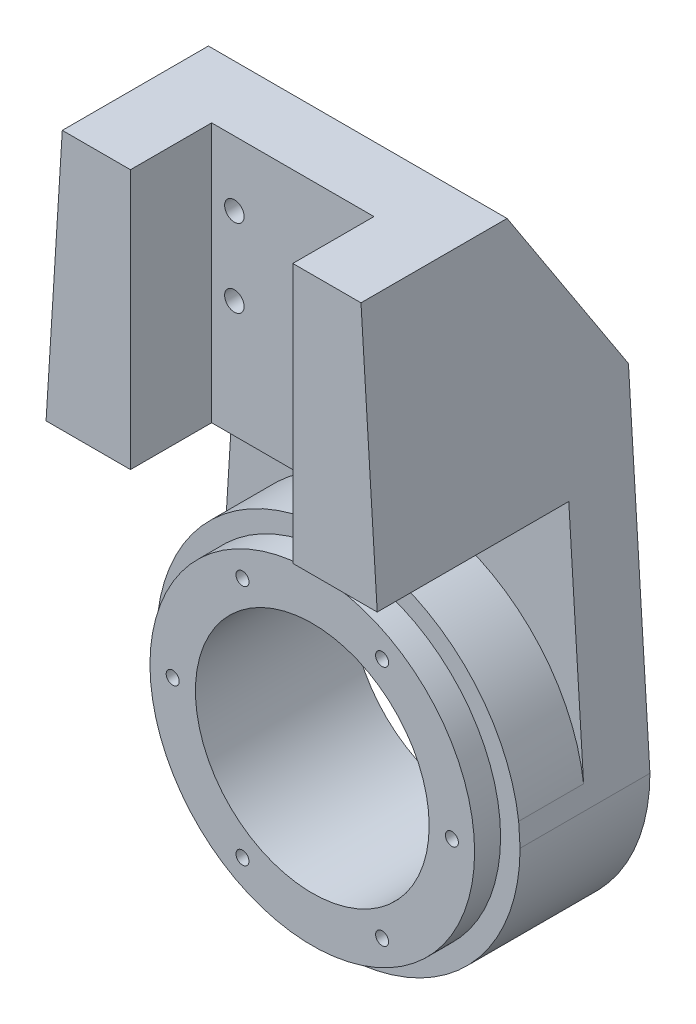
ISO-10303-21;
HEADER;
FILE_DESCRIPTION(('STEP AP214'),'2;1');
FILE_NAME('part.step','',(''),(''),'','','');
FILE_SCHEMA(('AUTOMOTIVE_DESIGN { 1 0 10303 214 1 1 1 1 }'));
ENDSEC;
DATA;
#1=APPLICATION_CONTEXT('core data for automotive mechanical design processes');
#2=APPLICATION_PROTOCOL_DEFINITION('international standard','automotive_design',2000,#1);
#3=PRODUCT_CONTEXT('',#1,'mechanical');
#4=PRODUCT('Part','Part','',(#3));
#5=PRODUCT_RELATED_PRODUCT_CATEGORY('part','',(#4));
#6=PRODUCT_DEFINITION_FORMATION('','',#4);
#7=PRODUCT_DEFINITION_CONTEXT('part definition',#1,'design');
#8=PRODUCT_DEFINITION('design','',#6,#7);
#9=PRODUCT_DEFINITION_SHAPE('','',#8);
#10=(LENGTH_UNIT() NAMED_UNIT(*) SI_UNIT(.MILLI.,.METRE.));
#11=(NAMED_UNIT(*) PLANE_ANGLE_UNIT() SI_UNIT($,.RADIAN.));
#12=(NAMED_UNIT(*) SI_UNIT($,.STERADIAN.) SOLID_ANGLE_UNIT());
#13=UNCERTAINTY_MEASURE_WITH_UNIT(LENGTH_MEASURE(1.E-05),#10,'distance_accuracy_value','');
#14=(GEOMETRIC_REPRESENTATION_CONTEXT(3) GLOBAL_UNCERTAINTY_ASSIGNED_CONTEXT((#13)) GLOBAL_UNIT_ASSIGNED_CONTEXT((#10,
#11,#12)) REPRESENTATION_CONTEXT('',''));
#15=CARTESIAN_POINT('',(0.,0.,0.));
#16=DIRECTION('',(0.,0.,1.));
#17=DIRECTION('',(1.,0.,0.));
#18=AXIS2_PLACEMENT_3D('',#15,#16,#17);
#19=CARTESIAN_POINT('',(0.,0.,10.));
#20=DIRECTION('',(0.,0.,-1.));
#21=DIRECTION('',(-1.,0.,0.));
#22=AXIS2_PLACEMENT_3D('',#19,#20,#21);
#23=CYLINDRICAL_SURFACE('',#22,28.);
#24=DIRECTION('',(0.,0.,-1.));
#25=VECTOR('',#24,1.);
#26=CARTESIAN_POINT('',(28.,0.,10.));
#27=LINE('',#26,#25);
#28=CARTESIAN_POINT('',(28.,0.,20.));
#29=VERTEX_POINT('',#28);
#30=CARTESIAN_POINT('',(28.,0.,0.));
#31=VERTEX_POINT('',#30);
#32=EDGE_CURVE('E167',#29,#31,#27,.T.);
#33=ORIENTED_EDGE('',*,*,#32,.F.);
#34=CARTESIAN_POINT('',(0.,0.,20.));
#35=DIRECTION('',(0.,0.,1.));
#36=DIRECTION('',(1.,0.,0.));
#37=AXIS2_PLACEMENT_3D('',#34,#35,#36);
#38=CIRCLE('',#37,28.);
#39=CARTESIAN_POINT('',(-28.,0.,20.));
#40=VERTEX_POINT('',#39);
#41=EDGE_CURVE('E190',#40,#29,#38,.T.);
#42=ORIENTED_EDGE('',*,*,#41,.F.);
#43=DIRECTION('',(0.,0.,-1.));
#44=VECTOR('',#43,1.);
#45=CARTESIAN_POINT('',(-28.,0.,10.));
#46=LINE('',#45,#44);
#47=CARTESIAN_POINT('',(-28.,0.,0.));
#48=VERTEX_POINT('',#47);
#49=EDGE_CURVE('E175',#40,#48,#46,.T.);
#50=ORIENTED_EDGE('',*,*,#49,.T.);
#51=CARTESIAN_POINT('',(0.,0.,0.));
#52=DIRECTION('',(0.,0.,1.));
#53=DIRECTION('',(1.,0.,0.));
#54=AXIS2_PLACEMENT_3D('',#51,#52,#53);
#55=CIRCLE('',#54,28.);
#56=EDGE_CURVE('E183',#48,#31,#55,.T.);
#57=ORIENTED_EDGE('',*,*,#56,.T.);
#58=EDGE_LOOP('',(#33,#42,#50,#57));
#59=FACE_BOUND('',#58,.T.);
#60=ADVANCED_FACE('F39',(#59),#23,.T.);
#61=CARTESIAN_POINT('',(0.,80.,10.));
#62=DIRECTION('',(0.,1.,0.));
#63=DIRECTION('',(0.,0.,1.));
#64=AXIS2_PLACEMENT_3D('',#61,#62,#63);
#65=PLANE('',#64);
#66=DIRECTION('',(0.,0.,-1.));
#67=VECTOR('',#66,1.);
#68=CARTESIAN_POINT('',(23.,80.,40.));
#69=LINE('',#68,#67);
#70=CARTESIAN_POINT('',(23.,80.,39.5));
#71=VERTEX_POINT('',#70);
#72=CARTESIAN_POINT('',(23.,80.,17.));
#73=VERTEX_POINT('',#72);
#74=EDGE_CURVE('E187',#71,#73,#69,.T.);
#75=ORIENTED_EDGE('',*,*,#74,.T.);
#76=DIRECTION('',(1.,0.,0.));
#77=VECTOR('',#76,1.);
#78=CARTESIAN_POINT('',(-25.,80.,17.));
#79=LINE('',#78,#77);
#80=CARTESIAN_POINT('',(17.,80.,17.));
#81=VERTEX_POINT('',#80);
#82=EDGE_CURVE('E228',#81,#73,#79,.T.);
#83=ORIENTED_EDGE('',*,*,#82,.F.);
#84=DIRECTION('',(1.,0.,0.));
#85=VECTOR('',#84,1.);
#86=CARTESIAN_POINT('',(5.00000000000001,80.,17.));
#87=LINE('',#86,#85);
#88=CARTESIAN_POINT('',(5.00000000000001,80.,17.));
#89=VERTEX_POINT('',#88);
#90=EDGE_CURVE('E327',#89,#81,#87,.T.);
#91=ORIENTED_EDGE('',*,*,#90,.F.);
#92=CARTESIAN_POINT('',(-5.,80.,17.));
#93=VERTEX_POINT('',#92);
#94=EDGE_CURVE('E226',#93,#89,#79,.T.);
#95=ORIENTED_EDGE('',*,*,#94,.F.);
#96=DIRECTION('',(1.,0.,0.));
#97=VECTOR('',#96,1.);
#98=CARTESIAN_POINT('',(-17.,80.,17.));
#99=LINE('',#98,#97);
#100=CARTESIAN_POINT('',(-17.,80.,17.));
#101=VERTEX_POINT('',#100);
#102=EDGE_CURVE('E225',#101,#93,#99,.T.);
#103=ORIENTED_EDGE('',*,*,#102,.F.);
#104=CARTESIAN_POINT('',(-23.,80.,17.));
#105=VERTEX_POINT('',#104);
#106=EDGE_CURVE('E214',#105,#101,#79,.T.);
#107=ORIENTED_EDGE('',*,*,#106,.F.);
#108=DIRECTION('',(0.,0.,-1.));
#109=VECTOR('',#108,1.);
#110=CARTESIAN_POINT('',(-23.,80.,40.));
#111=LINE('',#110,#109);
#112=CARTESIAN_POINT('',(-23.,80.,39.5));
#113=VERTEX_POINT('',#112);
#114=EDGE_CURVE('E61',#113,#105,#111,.T.);
#115=ORIENTED_EDGE('',*,*,#114,.F.);
#116=DIRECTION('',(-1.,0.,0.));
#117=VECTOR('',#116,1.);
#118=CARTESIAN_POINT('',(-28.,80.,39.5));
#119=LINE('',#118,#117);
#120=CARTESIAN_POINT('',(-12.5,80.,39.5));
#121=VERTEX_POINT('',#120);
#122=EDGE_CURVE('E351',#121,#113,#119,.T.);
#123=ORIENTED_EDGE('',*,*,#122,.F.);
#124=DIRECTION('',(0.,0.,1.));
#125=VECTOR('',#124,1.);
#126=CARTESIAN_POINT('',(-12.5,80.,39.5));
#127=LINE('',#126,#125);
#128=CARTESIAN_POINT('',(-12.5,80.,27.));
#129=VERTEX_POINT('',#128);
#130=EDGE_CURVE('E329',#129,#121,#127,.T.);
#131=ORIENTED_EDGE('',*,*,#130,.F.);
#132=DIRECTION('',(-1.,0.,0.));
#133=VECTOR('',#132,1.);
#134=CARTESIAN_POINT('',(-12.5,80.,27.));
#135=LINE('',#134,#133);
#136=CARTESIAN_POINT('',(12.5,80.,27.));
#137=VERTEX_POINT('',#136);
#138=EDGE_CURVE('E335',#137,#129,#135,.T.);
#139=ORIENTED_EDGE('',*,*,#138,.F.);
#140=DIRECTION('',(0.,0.,-1.));
#141=VECTOR('',#140,1.);
#142=CARTESIAN_POINT('',(12.5,80.,39.5));
#143=LINE('',#142,#141);
#144=CARTESIAN_POINT('',(12.5,80.,39.5));
#145=VERTEX_POINT('',#144);
#146=EDGE_CURVE('E331',#145,#137,#143,.T.);
#147=ORIENTED_EDGE('',*,*,#146,.F.);
#148=EDGE_CURVE('E353',#71,#145,#119,.T.);
#149=ORIENTED_EDGE('',*,*,#148,.F.);
#150=EDGE_LOOP('',(#75,#83,#91,#95,#103,#107,#115,#123,#131,#139,#147,#149));
#151=FACE_BOUND('',#150,.T.);
#152=ADVANCED_FACE('F220',(#151),#65,.T.);
#153=CARTESIAN_POINT('',(0.,0.,0.));
#154=DIRECTION('',(0.,0.,1.));
#155=DIRECTION('',(1.,0.,0.));
#156=AXIS2_PLACEMENT_3D('',#153,#154,#155);
#157=PLANE('',#156);
#158=CARTESIAN_POINT('',(-21.5,0.,0.));
#159=DIRECTION('',(0.,0.,1.));
#160=DIRECTION('',(1.,0.,0.));
#161=AXIS2_PLACEMENT_3D('',#158,#159,#160);
#162=CIRCLE('',#161,1.);
#163=CARTESIAN_POINT('',(-20.5,0.,0.));
#164=VERTEX_POINT('',#163);
#165=EDGE_CURVE('E383',#164,#164,#162,.T.);
#166=ORIENTED_EDGE('',*,*,#165,.T.);
#167=EDGE_LOOP('',(#166));
#168=FACE_BOUND('',#167,.T.);
#169=CARTESIAN_POINT('',(-10.7500000000001,-18.6195461813654,0.));
#170=DIRECTION('',(0.,0.,1.));
#171=DIRECTION('',(1.,0.,0.));
#172=AXIS2_PLACEMENT_3D('',#169,#170,#171);
#173=CIRCLE('',#172,1.);
#174=CARTESIAN_POINT('',(-9.75000000000009,-18.6195461813654,0.));
#175=VERTEX_POINT('',#174);
#176=EDGE_CURVE('E377',#175,#175,#173,.T.);
#177=ORIENTED_EDGE('',*,*,#176,.T.);
#178=EDGE_LOOP('',(#177));
#179=FACE_BOUND('',#178,.T.);
#180=CARTESIAN_POINT('',(10.75,-18.6195461813655,0.));
#181=DIRECTION('',(0.,0.,1.));
#182=DIRECTION('',(1.,0.,0.));
#183=AXIS2_PLACEMENT_3D('',#180,#181,#182);
#184=CIRCLE('',#183,1.);
#185=CARTESIAN_POINT('',(11.75,-18.6195461813655,0.));
#186=VERTEX_POINT('',#185);
#187=EDGE_CURVE('E371',#186,#186,#184,.T.);
#188=ORIENTED_EDGE('',*,*,#187,.T.);
#189=EDGE_LOOP('',(#188));
#190=FACE_BOUND('',#189,.T.);
#191=CARTESIAN_POINT('',(21.5,0.,0.));
#192=DIRECTION('',(0.,0.,1.));
#193=DIRECTION('',(1.,0.,0.));
#194=AXIS2_PLACEMENT_3D('',#191,#192,#193);
#195=CIRCLE('',#194,1.);
#196=CARTESIAN_POINT('',(22.5,0.,0.));
#197=VERTEX_POINT('',#196);
#198=EDGE_CURVE('E365',#197,#197,#195,.T.);
#199=ORIENTED_EDGE('',*,*,#198,.T.);
#200=EDGE_LOOP('',(#199));
#201=FACE_BOUND('',#200,.T.);
#202=CARTESIAN_POINT('',(10.7500000000001,18.6195461813654,0.));
#203=DIRECTION('',(0.,0.,1.));
#204=DIRECTION('',(1.,0.,0.));
#205=AXIS2_PLACEMENT_3D('',#202,#203,#204);
#206=CIRCLE('',#205,1.);
#207=CARTESIAN_POINT('',(11.7500000000001,18.6195461813654,0.));
#208=VERTEX_POINT('',#207);
#209=EDGE_CURVE('E358',#208,#208,#206,.T.);
#210=ORIENTED_EDGE('',*,*,#209,.T.);
#211=EDGE_LOOP('',(#210));
#212=FACE_BOUND('',#211,.T.);
#213=CARTESIAN_POINT('',(-10.75,18.6195461813655,0.));
#214=DIRECTION('',(0.,0.,1.));
#215=DIRECTION('',(1.,0.,0.));
#216=AXIS2_PLACEMENT_3D('',#213,#214,#215);
#217=CIRCLE('',#216,1.00000000000001);
#218=CARTESIAN_POINT('',(-9.74999999999994,18.6195461813655,0.));
#219=VERTEX_POINT('',#218);
#220=EDGE_CURVE('E388',#219,#219,#217,.T.);
#221=ORIENTED_EDGE('',*,*,#220,.T.);
#222=EDGE_LOOP('',(#221));
#223=FACE_BOUND('',#222,.T.);
#224=CARTESIAN_POINT('',(0.,0.,0.));
#225=DIRECTION('',(0.,0.,1.));
#226=DIRECTION('',(1.,0.,0.));
#227=AXIS2_PLACEMENT_3D('',#224,#225,#226);
#228=CIRCLE('',#227,18.);
#229=CARTESIAN_POINT('',(18.,0.,0.));
#230=VERTEX_POINT('',#229);
#231=EDGE_CURVE('E176',#230,#230,#228,.T.);
#232=ORIENTED_EDGE('',*,*,#231,.T.);
#233=EDGE_LOOP('',(#232));
#234=FACE_BOUND('',#233,.T.);
#235=DIRECTION('',(1.,0.,0.));
#236=VECTOR('',#235,1.);
#237=CARTESIAN_POINT('',(-25.,53.,0.));
#238=LINE('',#237,#236);
#239=CARTESIAN_POINT('',(17.,53.,0.));
#240=VERTEX_POINT('',#239);
#241=CARTESIAN_POINT('',(24.6875,53.,0.));
#242=VERTEX_POINT('',#241);
#243=EDGE_CURVE('E186',#240,#242,#238,.T.);
#244=ORIENTED_EDGE('',*,*,#243,.T.);
#245=DIRECTION('',(-0.0623782861551805,0.998052578482889,0.));
#246=VECTOR('',#245,1.);
#247=CARTESIAN_POINT('',(28.,0.,0.));
#248=LINE('',#247,#246);
#249=EDGE_CURVE('E53',#31,#242,#248,.T.);
#250=ORIENTED_EDGE('',*,*,#249,.F.);
#251=ORIENTED_EDGE('',*,*,#56,.F.);
#252=DIRECTION('',(0.0623782861551805,0.998052578482889,0.));
#253=VECTOR('',#252,1.);
#254=CARTESIAN_POINT('',(-28.,0.,0.));
#255=LINE('',#254,#253);
#256=CARTESIAN_POINT('',(-24.6875,53.,0.));
#257=VERTEX_POINT('',#256);
#258=EDGE_CURVE('E251',#48,#257,#255,.T.);
#259=ORIENTED_EDGE('',*,*,#258,.T.);
#260=CARTESIAN_POINT('',(-17.,53.,0.));
#261=VERTEX_POINT('',#260);
#262=EDGE_CURVE('E216',#257,#261,#238,.T.);
#263=ORIENTED_EDGE('',*,*,#262,.T.);
#264=DIRECTION('',(-1.,0.,0.));
#265=VECTOR('',#264,1.);
#266=CARTESIAN_POINT('',(-17.,53.,0.));
#267=LINE('',#266,#265);
#268=CARTESIAN_POINT('',(-5.,53.,0.));
#269=VERTEX_POINT('',#268);
#270=EDGE_CURVE('E324',#269,#261,#267,.T.);
#271=ORIENTED_EDGE('',*,*,#270,.F.);
#272=CARTESIAN_POINT('',(5.,53.,0.));
#273=VERTEX_POINT('',#272);
#274=EDGE_CURVE('E229',#269,#273,#238,.T.);
#275=ORIENTED_EDGE('',*,*,#274,.T.);
#276=DIRECTION('',(-1.,0.,0.));
#277=VECTOR('',#276,1.);
#278=CARTESIAN_POINT('',(5.,53.,0.));
#279=LINE('',#278,#277);
#280=EDGE_CURVE('E480',#240,#273,#279,.T.);
#281=ORIENTED_EDGE('',*,*,#280,.F.);
#282=EDGE_LOOP('',(#244,#250,#251,#259,#263,#271,#275,#281));
#283=FACE_BOUND('',#282,.T.);
#284=ADVANCED_FACE('F181',(#168,#179,#190,#201,#212,#223,#234,#283),#157,.F.);
#285=CARTESIAN_POINT('',(0.,0.,39.5));
#286=DIRECTION('',(0.,0.,-1.));
#287=DIRECTION('',(-1.,0.,0.));
#288=AXIS2_PLACEMENT_3D('',#285,#286,#287);
#289=PLANE('',#288);
#290=DIRECTION('',(0.0623782861551805,0.998052578482889,0.));
#291=VECTOR('',#290,1.);
#292=CARTESIAN_POINT('',(-27.8910505836576,1.7431906614786,39.5));
#293=LINE('',#292,#291);
#294=CARTESIAN_POINT('',(-25.5,40.,39.5));
#295=VERTEX_POINT('',#294);
#296=EDGE_CURVE('E241',#295,#113,#293,.T.);
#297=ORIENTED_EDGE('',*,*,#296,.F.);
#298=DIRECTION('',(1.,0.,0.));
#299=VECTOR('',#298,1.);
#300=CARTESIAN_POINT('',(-28.,40.,39.5));
#301=LINE('',#300,#299);
#302=CARTESIAN_POINT('',(-12.5,40.,39.5));
#303=VERTEX_POINT('',#302);
#304=EDGE_CURVE('E349',#295,#303,#301,.T.);
#305=ORIENTED_EDGE('',*,*,#304,.T.);
#306=DIRECTION('',(0.,1.,0.));
#307=VECTOR('',#306,1.);
#308=CARTESIAN_POINT('',(-12.5,0.,39.5));
#309=LINE('',#308,#307);
#310=EDGE_CURVE('E204',#303,#121,#309,.T.);
#311=ORIENTED_EDGE('',*,*,#310,.T.);
#312=ORIENTED_EDGE('',*,*,#122,.T.);
#313=EDGE_LOOP('',(#297,#305,#311,#312));
#314=FACE_BOUND('',#313,.T.);
#315=ADVANCED_FACE('F425',(#314),#289,.F.);
#316=CARTESIAN_POINT('',(0.,0.,10.));
#317=DIRECTION('',(0.,0.,1.));
#318=DIRECTION('',(1.,0.,0.));
#319=AXIS2_PLACEMENT_3D('',#316,#317,#318);
#320=PLANE('',#319);
#321=DIRECTION('',(0.0623782861551805,-0.998052578482889,0.));
#322=VECTOR('',#321,1.);
#323=CARTESIAN_POINT('',(27.8910505836576,1.7431906614786,10.));
#324=LINE('',#323,#322);
#325=CARTESIAN_POINT('',(25.5,40.,10.));
#326=VERTEX_POINT('',#325);
#327=CARTESIAN_POINT('',(27.7821011673152,3.48638132295738,10.));
#328=VERTEX_POINT('',#327);
#329=EDGE_CURVE('E257',#326,#328,#324,.T.);
#330=ORIENTED_EDGE('',*,*,#329,.F.);
#331=DIRECTION('',(1.,0.,0.));
#332=VECTOR('',#331,1.);
#333=CARTESIAN_POINT('',(-28.,40.,10.));
#334=LINE('',#333,#332);
#335=CARTESIAN_POINT('',(-25.5,40.,10.));
#336=VERTEX_POINT('',#335);
#337=EDGE_CURVE('E348',#336,#326,#334,.T.);
#338=ORIENTED_EDGE('',*,*,#337,.F.);
#339=DIRECTION('',(-0.0623782861551805,-0.998052578482889,0.));
#340=VECTOR('',#339,1.);
#341=CARTESIAN_POINT('',(-27.8910505836576,1.7431906614786,10.));
#342=LINE('',#341,#340);
#343=CARTESIAN_POINT('',(-27.7821011673152,3.48638132295738,10.));
#344=VERTEX_POINT('',#343);
#345=EDGE_CURVE('E245',#336,#344,#342,.T.);
#346=ORIENTED_EDGE('',*,*,#345,.T.);
#347=CARTESIAN_POINT('',(0.,0.,10.));
#348=DIRECTION('',(0.,0.,1.));
#349=DIRECTION('',(1.,0.,0.));
#350=AXIS2_PLACEMENT_3D('',#347,#348,#349);
#351=CIRCLE('',#350,28.);
#352=EDGE_CURVE('E197',#328,#344,#351,.T.);
#353=ORIENTED_EDGE('',*,*,#352,.F.);
#354=EDGE_LOOP('',(#330,#338,#346,#353));
#355=FACE_BOUND('',#354,.T.);
#356=ADVANCED_FACE('F414',(#355),#320,.T.);
#357=CARTESIAN_POINT('',(27.7821011673152,3.48638132295725,20.));
#358=VERTEX_POINT('',#357);
#359=CARTESIAN_POINT('',(-27.7821011673152,3.48638132295725,20.));
#360=VERTEX_POINT('',#359);
#361=EDGE_CURVE('E194',#358,#360,#38,.T.);
#362=ORIENTED_EDGE('',*,*,#361,.F.);
#363=DIRECTION('',(0.,0.,-1.));
#364=VECTOR('',#363,1.);
#365=CARTESIAN_POINT('',(27.7821011673152,3.48638132295725,10.));
#366=LINE('',#365,#364);
#367=EDGE_CURVE('E254',#358,#328,#366,.T.);
#368=ORIENTED_EDGE('',*,*,#367,.T.);
#369=ORIENTED_EDGE('',*,*,#352,.T.);
#370=DIRECTION('',(0.,0.,-1.));
#371=VECTOR('',#370,1.);
#372=CARTESIAN_POINT('',(-27.7821011673152,3.48638132295725,10.));
#373=LINE('',#372,#371);
#374=EDGE_CURVE('E237',#360,#344,#373,.T.);
#375=ORIENTED_EDGE('',*,*,#374,.F.);
#376=EDGE_LOOP('',(#362,#368,#369,#375));
#377=FACE_BOUND('',#376,.T.);
#378=ADVANCED_FACE('F41',(#377),#23,.T.);
#379=CARTESIAN_POINT('',(0.,0.,20.));
#380=DIRECTION('',(0.,0.,1.));
#381=DIRECTION('',(1.,0.,0.));
#382=AXIS2_PLACEMENT_3D('',#379,#380,#381);
#383=PLANE('',#382);
#384=DIRECTION('',(0.0623782861551805,-0.998052578482889,0.));
#385=VECTOR('',#384,1.);
#386=CARTESIAN_POINT('',(27.8910505836576,1.7431906614786,20.));
#387=LINE('',#386,#385);
#388=EDGE_CURVE('E170',#358,#29,#387,.T.);
#389=ORIENTED_EDGE('',*,*,#388,.F.);
#390=ORIENTED_EDGE('',*,*,#361,.T.);
#391=DIRECTION('',(-0.0623782861551805,-0.998052578482889,0.));
#392=VECTOR('',#391,1.);
#393=CARTESIAN_POINT('',(-27.8910505836576,1.7431906614786,20.));
#394=LINE('',#393,#392);
#395=EDGE_CURVE('E233',#360,#40,#394,.T.);
#396=ORIENTED_EDGE('',*,*,#395,.T.);
#397=ORIENTED_EDGE('',*,*,#41,.T.);
#398=EDGE_LOOP('',(#389,#390,#396,#397));
#399=FACE_BOUND('',#398,.T.);
#400=CARTESIAN_POINT('',(0.,0.,20.));
#401=DIRECTION('',(0.,0.,1.));
#402=DIRECTION('',(1.,0.,0.));
#403=AXIS2_PLACEMENT_3D('',#400,#401,#402);
#404=CIRCLE('',#403,25.);
#405=CARTESIAN_POINT('',(25.,0.,20.));
#406=VERTEX_POINT('',#405);
#407=EDGE_CURVE('E200',#406,#406,#404,.T.);
#408=ORIENTED_EDGE('',*,*,#407,.F.);
#409=EDGE_LOOP('',(#408));
#410=FACE_BOUND('',#409,.T.);
#411=ADVANCED_FACE('F404',(#399,#410),#383,.T.);
#412=CARTESIAN_POINT('',(-28.,40.,39.5));
#413=DIRECTION('',(0.,1.,0.));
#414=DIRECTION('',(0.,0.,1.));
#415=AXIS2_PLACEMENT_3D('',#412,#413,#414);
#416=PLANE('',#415);
#417=ORIENTED_EDGE('',*,*,#337,.T.);
#418=DIRECTION('',(0.,0.,1.));
#419=VECTOR('',#418,1.);
#420=CARTESIAN_POINT('',(25.5,40.,39.5));
#421=LINE('',#420,#419);
#422=CARTESIAN_POINT('',(25.5,40.,39.5));
#423=VERTEX_POINT('',#422);
#424=EDGE_CURVE('E259',#326,#423,#421,.T.);
#425=ORIENTED_EDGE('',*,*,#424,.T.);
#426=CARTESIAN_POINT('',(12.5,40.,39.5));
#427=VERTEX_POINT('',#426);
#428=EDGE_CURVE('E352',#427,#423,#301,.T.);
#429=ORIENTED_EDGE('',*,*,#428,.F.);
#430=DIRECTION('',(0.,0.,-1.));
#431=VECTOR('',#430,1.);
#432=CARTESIAN_POINT('',(12.5,40.,39.5));
#433=LINE('',#432,#431);
#434=CARTESIAN_POINT('',(12.5,40.,27.));
#435=VERTEX_POINT('',#434);
#436=EDGE_CURVE('E341',#427,#435,#433,.T.);
#437=ORIENTED_EDGE('',*,*,#436,.T.);
#438=DIRECTION('',(-1.,0.,0.));
#439=VECTOR('',#438,1.);
#440=CARTESIAN_POINT('',(-28.,40.,27.));
#441=LINE('',#440,#439);
#442=CARTESIAN_POINT('',(-12.5,40.,27.));
#443=VERTEX_POINT('',#442);
#444=EDGE_CURVE('E207',#435,#443,#441,.T.);
#445=ORIENTED_EDGE('',*,*,#444,.T.);
#446=DIRECTION('',(0.,0.,1.));
#447=VECTOR('',#446,1.);
#448=CARTESIAN_POINT('',(-12.5,40.,39.5));
#449=LINE('',#448,#447);
#450=EDGE_CURVE('E345',#443,#303,#449,.T.);
#451=ORIENTED_EDGE('',*,*,#450,.T.);
#452=ORIENTED_EDGE('',*,*,#304,.F.);
#453=DIRECTION('',(0.,0.,1.));
#454=VECTOR('',#453,1.);
#455=CARTESIAN_POINT('',(-25.5,40.,39.5));
#456=LINE('',#455,#454);
#457=EDGE_CURVE('E248',#336,#295,#456,.T.);
#458=ORIENTED_EDGE('',*,*,#457,.F.);
#459=EDGE_LOOP('',(#417,#425,#429,#437,#445,#451,#452,#458));
#460=FACE_BOUND('',#459,.T.);
#461=ADVANCED_FACE('F406',(#460),#416,.F.);
#462=CARTESIAN_POINT('',(-25.,53.,0.));
#463=DIRECTION('',(0.,0.532813269686139,-0.846232840089751));
#464=DIRECTION('',(0.,0.846232840089751,0.532813269686139));
#465=AXIS2_PLACEMENT_3D('',#462,#463,#464);
#466=PLANE('',#465);
#467=ORIENTED_EDGE('',*,*,#262,.F.);
#468=DIRECTION('',(0.0528157332421895,0.845051731875034,0.532069608958355));
#469=VECTOR('',#468,1.);
#470=CARTESIAN_POINT('',(-24.6883717192743,52.9860524916105,-0.00878176454156829));
#471=LINE('',#470,#469);
#472=EDGE_CURVE('E47',#257,#105,#471,.T.);
#473=ORIENTED_EDGE('',*,*,#472,.T.);
#474=ORIENTED_EDGE('',*,*,#106,.T.);
#475=DIRECTION('',(0.,-0.846232840089751,-0.532813269686139));
#476=VECTOR('',#475,1.);
#477=CARTESIAN_POINT('',(-17.,53.,0.));
#478=LINE('',#477,#476);
#479=EDGE_CURVE('E315',#101,#261,#478,.T.);
#480=ORIENTED_EDGE('',*,*,#479,.T.);
#481=EDGE_LOOP('',(#467,#473,#474,#480));
#482=FACE_BOUND('',#481,.T.);
#483=ADVANCED_FACE('F212',(#482),#466,.T.);
#484=CARTESIAN_POINT('',(-17.,53.,0.));
#485=DIRECTION('',(-1.,0.,0.));
#486=DIRECTION('',(0.,0.,1.));
#487=AXIS2_PLACEMENT_3D('',#484,#485,#486);
#488=PLANE('',#487);
#489=ORIENTED_EDGE('',*,*,#479,.F.);
#490=DIRECTION('',(0.,1.,0.));
#491=VECTOR('',#490,1.);
#492=CARTESIAN_POINT('',(-17.,53.,17.));
#493=LINE('',#492,#491);
#494=CARTESIAN_POINT('',(-17.,53.,17.));
#495=VERTEX_POINT('',#494);
#496=EDGE_CURVE('E313',#495,#101,#493,.T.);
#497=ORIENTED_EDGE('',*,*,#496,.F.);
#498=DIRECTION('',(0.,0.,1.));
#499=VECTOR('',#498,1.);
#500=CARTESIAN_POINT('',(-17.,53.,0.));
#501=LINE('',#500,#499);
#502=EDGE_CURVE('E314',#261,#495,#501,.T.);
#503=ORIENTED_EDGE('',*,*,#502,.F.);
#504=EDGE_LOOP('',(#489,#497,#503));
#505=FACE_BOUND('',#504,.T.);
#506=ADVANCED_FACE('F503',(#505),#488,.F.);
#507=CARTESIAN_POINT('',(-5.,53.,0.));
#508=DIRECTION('',(1.,0.,0.));
#509=DIRECTION('',(0.,0.,-1.));
#510=AXIS2_PLACEMENT_3D('',#507,#508,#509);
#511=PLANE('',#510);
#512=DIRECTION('',(0.,0.846232840089751,0.532813269686139));
#513=VECTOR('',#512,1.);
#514=CARTESIAN_POINT('',(-5.,53.,0.));
#515=LINE('',#514,#513);
#516=EDGE_CURVE('E320',#269,#93,#515,.T.);
#517=ORIENTED_EDGE('',*,*,#516,.F.);
#518=DIRECTION('',(0.,0.,-1.));
#519=VECTOR('',#518,1.);
#520=CARTESIAN_POINT('',(-5.,53.,0.));
#521=LINE('',#520,#519);
#522=CARTESIAN_POINT('',(-4.99999999999999,53.,17.));
#523=VERTEX_POINT('',#522);
#524=EDGE_CURVE('E497',#523,#269,#521,.T.);
#525=ORIENTED_EDGE('',*,*,#524,.F.);
#526=DIRECTION('',(0.,1.,0.));
#527=VECTOR('',#526,1.);
#528=CARTESIAN_POINT('',(-4.99999999999999,53.,17.));
#529=LINE('',#528,#527);
#530=EDGE_CURVE('E311',#523,#93,#529,.T.);
#531=ORIENTED_EDGE('',*,*,#530,.T.);
#532=EDGE_LOOP('',(#517,#525,#531));
#533=FACE_BOUND('',#532,.T.);
#534=ADVANCED_FACE('F505',(#533),#511,.F.);
#535=CARTESIAN_POINT('',(5.,53.,0.));
#536=DIRECTION('',(-1.,0.,0.));
#537=DIRECTION('',(0.,0.,1.));
#538=AXIS2_PLACEMENT_3D('',#535,#536,#537);
#539=PLANE('',#538);
#540=DIRECTION('',(0.,-0.846232840089751,-0.532813269686139));
#541=VECTOR('',#540,1.);
#542=CARTESIAN_POINT('',(5.,53.,0.));
#543=LINE('',#542,#541);
#544=EDGE_CURVE('E474',#89,#273,#543,.T.);
#545=ORIENTED_EDGE('',*,*,#544,.F.);
#546=DIRECTION('',(0.,1.,0.));
#547=VECTOR('',#546,1.);
#548=CARTESIAN_POINT('',(5.00000000000001,53.,17.));
#549=LINE('',#548,#547);
#550=CARTESIAN_POINT('',(5.00000000000001,53.,17.));
#551=VERTEX_POINT('',#550);
#552=EDGE_CURVE('E487',#551,#89,#549,.T.);
#553=ORIENTED_EDGE('',*,*,#552,.F.);
#554=DIRECTION('',(0.,0.,1.));
#555=VECTOR('',#554,1.);
#556=CARTESIAN_POINT('',(5.,53.,0.));
#557=LINE('',#556,#555);
#558=EDGE_CURVE('E494',#273,#551,#557,.T.);
#559=ORIENTED_EDGE('',*,*,#558,.F.);
#560=EDGE_LOOP('',(#545,#553,#559));
#561=FACE_BOUND('',#560,.T.);
#562=ADVANCED_FACE('F511',(#561),#539,.F.);
#563=CARTESIAN_POINT('',(17.,53.,0.));
#564=DIRECTION('',(1.,0.,0.));
#565=DIRECTION('',(0.,0.,-1.));
#566=AXIS2_PLACEMENT_3D('',#563,#564,#565);
#567=PLANE('',#566);
#568=DIRECTION('',(0.,0.846232840089751,0.532813269686139));
#569=VECTOR('',#568,1.);
#570=CARTESIAN_POINT('',(17.,53.,0.));
#571=LINE('',#570,#569);
#572=EDGE_CURVE('E466',#240,#81,#571,.T.);
#573=ORIENTED_EDGE('',*,*,#572,.F.);
#574=DIRECTION('',(0.,0.,-1.));
#575=VECTOR('',#574,1.);
#576=CARTESIAN_POINT('',(17.,53.,0.));
#577=LINE('',#576,#575);
#578=CARTESIAN_POINT('',(17.,53.,17.));
#579=VERTEX_POINT('',#578);
#580=EDGE_CURVE('E471',#579,#240,#577,.T.);
#581=ORIENTED_EDGE('',*,*,#580,.F.);
#582=DIRECTION('',(0.,1.,0.));
#583=VECTOR('',#582,1.);
#584=CARTESIAN_POINT('',(17.,53.,17.));
#585=LINE('',#584,#583);
#586=EDGE_CURVE('E332',#579,#81,#585,.T.);
#587=ORIENTED_EDGE('',*,*,#586,.T.);
#588=EDGE_LOOP('',(#573,#581,#587));
#589=FACE_BOUND('',#588,.T.);
#590=ADVANCED_FACE('F432',(#589),#567,.F.);
#591=CARTESIAN_POINT('',(0.,0.,10.));
#592=DIRECTION('',(0.,0.,-1.));
#593=DIRECTION('',(-1.,0.,0.));
#594=AXIS2_PLACEMENT_3D('',#591,#592,#593);
#595=CYLINDRICAL_SURFACE('',#594,18.);
#596=ORIENTED_EDGE('',*,*,#231,.F.);
#597=EDGE_LOOP('',(#596));
#598=FACE_BOUND('',#597,.T.);
#599=CARTESIAN_POINT('',(0.,0.,24.));
#600=DIRECTION('',(0.,0.,1.));
#601=DIRECTION('',(1.,0.,0.));
#602=AXIS2_PLACEMENT_3D('',#599,#600,#601);
#603=CIRCLE('',#602,18.);
#604=CARTESIAN_POINT('',(18.,0.,24.));
#605=VERTEX_POINT('',#604);
#606=EDGE_CURVE('E391',#605,#605,#603,.T.);
#607=ORIENTED_EDGE('',*,*,#606,.T.);
#608=EDGE_LOOP('',(#607));
#609=FACE_BOUND('',#608,.T.);
#610=ADVANCED_FACE('F429',(#598,#609),#595,.F.);
#611=CARTESIAN_POINT('',(0.,0.,24.));
#612=DIRECTION('',(0.,0.,1.));
#613=DIRECTION('',(1.,0.,0.));
#614=AXIS2_PLACEMENT_3D('',#611,#612,#613);
#615=PLANE('',#614);
#616=CARTESIAN_POINT('',(-21.5,0.,24.));
#617=DIRECTION('',(0.,0.,1.));
#618=DIRECTION('',(1.,0.,0.));
#619=AXIS2_PLACEMENT_3D('',#616,#617,#618);
#620=CIRCLE('',#619,1.);
#621=CARTESIAN_POINT('',(-20.5,0.,24.));
#622=VERTEX_POINT('',#621);
#623=EDGE_CURVE('E355',#622,#622,#620,.T.);
#624=ORIENTED_EDGE('',*,*,#623,.F.);
#625=EDGE_LOOP('',(#624));
#626=FACE_BOUND('',#625,.T.);
#627=CARTESIAN_POINT('',(-10.7500000000001,-18.6195461813654,24.));
#628=DIRECTION('',(0.,0.,1.));
#629=DIRECTION('',(1.,0.,0.));
#630=AXIS2_PLACEMENT_3D('',#627,#628,#629);
#631=CIRCLE('',#630,1.);
#632=CARTESIAN_POINT('',(-9.75000000000009,-18.6195461813654,24.));
#633=VERTEX_POINT('',#632);
#634=EDGE_CURVE('E380',#633,#633,#631,.T.);
#635=ORIENTED_EDGE('',*,*,#634,.F.);
#636=EDGE_LOOP('',(#635));
#637=FACE_BOUND('',#636,.T.);
#638=CARTESIAN_POINT('',(10.75,-18.6195461813655,24.));
#639=DIRECTION('',(0.,0.,1.));
#640=DIRECTION('',(1.,0.,0.));
#641=AXIS2_PLACEMENT_3D('',#638,#639,#640);
#642=CIRCLE('',#641,1.);
#643=CARTESIAN_POINT('',(11.75,-18.6195461813655,24.));
#644=VERTEX_POINT('',#643);
#645=EDGE_CURVE('E374',#644,#644,#642,.T.);
#646=ORIENTED_EDGE('',*,*,#645,.F.);
#647=EDGE_LOOP('',(#646));
#648=FACE_BOUND('',#647,.T.);
#649=CARTESIAN_POINT('',(21.5,0.,24.));
#650=DIRECTION('',(0.,0.,1.));
#651=DIRECTION('',(1.,0.,0.));
#652=AXIS2_PLACEMENT_3D('',#649,#650,#651);
#653=CIRCLE('',#652,1.);
#654=CARTESIAN_POINT('',(22.5,0.,24.));
#655=VERTEX_POINT('',#654);
#656=EDGE_CURVE('E368',#655,#655,#653,.T.);
#657=ORIENTED_EDGE('',*,*,#656,.F.);
#658=EDGE_LOOP('',(#657));
#659=FACE_BOUND('',#658,.T.);
#660=CARTESIAN_POINT('',(10.7500000000001,18.6195461813654,24.));
#661=DIRECTION('',(0.,0.,1.));
#662=DIRECTION('',(1.,0.,0.));
#663=AXIS2_PLACEMENT_3D('',#660,#661,#662);
#664=CIRCLE('',#663,1.);
#665=CARTESIAN_POINT('',(11.7500000000001,18.6195461813654,24.));
#666=VERTEX_POINT('',#665);
#667=EDGE_CURVE('E362',#666,#666,#664,.T.);
#668=ORIENTED_EDGE('',*,*,#667,.F.);
#669=EDGE_LOOP('',(#668));
#670=FACE_BOUND('',#669,.T.);
#671=CARTESIAN_POINT('',(-10.75,18.6195461813655,24.));
#672=DIRECTION('',(0.,0.,1.));
#673=DIRECTION('',(1.,0.,0.));
#674=AXIS2_PLACEMENT_3D('',#671,#672,#673);
#675=CIRCLE('',#674,1.00000000000001);
#676=CARTESIAN_POINT('',(-9.74999999999994,18.6195461813655,24.));
#677=VERTEX_POINT('',#676);
#678=EDGE_CURVE('E361',#677,#677,#675,.T.);
#679=ORIENTED_EDGE('',*,*,#678,.F.);
#680=EDGE_LOOP('',(#679));
#681=FACE_BOUND('',#680,.T.);
#682=CARTESIAN_POINT('',(0.,0.,24.));
#683=DIRECTION('',(0.,0.,1.));
#684=DIRECTION('',(1.,0.,0.));
#685=AXIS2_PLACEMENT_3D('',#682,#683,#684);
#686=CIRCLE('',#685,25.);
#687=CARTESIAN_POINT('',(25.,0.,24.));
#688=VERTEX_POINT('',#687);
#689=EDGE_CURVE('E396',#688,#688,#686,.T.);
#690=ORIENTED_EDGE('',*,*,#689,.T.);
#691=EDGE_LOOP('',(#690));
#692=FACE_BOUND('',#691,.T.);
#693=ORIENTED_EDGE('',*,*,#606,.F.);
#694=EDGE_LOOP('',(#693));
#695=FACE_BOUND('',#694,.T.);
#696=ADVANCED_FACE('F431',(#626,#637,#648,#659,#670,#681,#692,#695),#615,.T.);
#697=CARTESIAN_POINT('',(0.,0.,24.));
#698=DIRECTION('',(0.,0.,-1.));
#699=DIRECTION('',(-1.,0.,0.));
#700=AXIS2_PLACEMENT_3D('',#697,#698,#699);
#701=CYLINDRICAL_SURFACE('',#700,25.);
#702=ORIENTED_EDGE('',*,*,#689,.F.);
#703=EDGE_LOOP('',(#702));
#704=FACE_BOUND('',#703,.T.);
#705=ORIENTED_EDGE('',*,*,#407,.T.);
#706=EDGE_LOOP('',(#705));
#707=FACE_BOUND('',#706,.T.);
#708=ADVANCED_FACE('F402',(#704,#707),#701,.T.);
#709=CARTESIAN_POINT('',(-10.75,18.6195461813655,0.));
#710=DIRECTION('',(0.,0.,1.));
#711=DIRECTION('',(1.,0.,0.));
#712=AXIS2_PLACEMENT_3D('',#709,#710,#711);
#713=CYLINDRICAL_SURFACE('',#712,1.00000000000001);
#714=ORIENTED_EDGE('',*,*,#220,.F.);
#715=EDGE_LOOP('',(#714));
#716=FACE_BOUND('',#715,.T.);
#717=ORIENTED_EDGE('',*,*,#678,.T.);
#718=EDGE_LOOP('',(#717));
#719=FACE_BOUND('',#718,.T.);
#720=ADVANCED_FACE('F530',(#716,#719),#713,.F.);
#721=CARTESIAN_POINT('',(10.7500000000001,18.6195461813654,0.));
#722=DIRECTION('',(0.,0.,1.));
#723=DIRECTION('',(1.,0.,0.));
#724=AXIS2_PLACEMENT_3D('',#721,#722,#723);
#725=CYLINDRICAL_SURFACE('',#724,1.);
#726=ORIENTED_EDGE('',*,*,#209,.F.);
#727=EDGE_LOOP('',(#726));
#728=FACE_BOUND('',#727,.T.);
#729=ORIENTED_EDGE('',*,*,#667,.T.);
#730=EDGE_LOOP('',(#729));
#731=FACE_BOUND('',#730,.T.);
#732=ADVANCED_FACE('F526',(#728,#731),#725,.F.);
#733=CARTESIAN_POINT('',(21.5,0.,0.));
#734=DIRECTION('',(0.,0.,1.));
#735=DIRECTION('',(1.,0.,0.));
#736=AXIS2_PLACEMENT_3D('',#733,#734,#735);
#737=CYLINDRICAL_SURFACE('',#736,1.);
#738=ORIENTED_EDGE('',*,*,#198,.F.);
#739=EDGE_LOOP('',(#738));
#740=FACE_BOUND('',#739,.T.);
#741=ORIENTED_EDGE('',*,*,#656,.T.);
#742=EDGE_LOOP('',(#741));
#743=FACE_BOUND('',#742,.T.);
#744=ADVANCED_FACE('F529',(#740,#743),#737,.F.);
#745=CARTESIAN_POINT('',(10.75,-18.6195461813655,0.));
#746=DIRECTION('',(0.,0.,1.));
#747=DIRECTION('',(1.,0.,0.));
#748=AXIS2_PLACEMENT_3D('',#745,#746,#747);
#749=CYLINDRICAL_SURFACE('',#748,1.);
#750=ORIENTED_EDGE('',*,*,#187,.F.);
#751=EDGE_LOOP('',(#750));
#752=FACE_BOUND('',#751,.T.);
#753=ORIENTED_EDGE('',*,*,#645,.T.);
#754=EDGE_LOOP('',(#753));
#755=FACE_BOUND('',#754,.T.);
#756=ADVANCED_FACE('F534',(#752,#755),#749,.F.);
#757=CARTESIAN_POINT('',(-10.7500000000001,-18.6195461813654,0.));
#758=DIRECTION('',(0.,0.,1.));
#759=DIRECTION('',(1.,0.,0.));
#760=AXIS2_PLACEMENT_3D('',#757,#758,#759);
#761=CYLINDRICAL_SURFACE('',#760,1.);
#762=ORIENTED_EDGE('',*,*,#176,.F.);
#763=EDGE_LOOP('',(#762));
#764=FACE_BOUND('',#763,.T.);
#765=ORIENTED_EDGE('',*,*,#634,.T.);
#766=EDGE_LOOP('',(#765));
#767=FACE_BOUND('',#766,.T.);
#768=ADVANCED_FACE('F538',(#764,#767),#761,.F.);
#769=CARTESIAN_POINT('',(-21.5,0.,0.));
#770=DIRECTION('',(0.,0.,1.));
#771=DIRECTION('',(1.,0.,0.));
#772=AXIS2_PLACEMENT_3D('',#769,#770,#771);
#773=CYLINDRICAL_SURFACE('',#772,1.);
#774=ORIENTED_EDGE('',*,*,#165,.F.);
#775=EDGE_LOOP('',(#774));
#776=FACE_BOUND('',#775,.T.);
#777=ORIENTED_EDGE('',*,*,#623,.T.);
#778=EDGE_LOOP('',(#777));
#779=FACE_BOUND('',#778,.T.);
#780=ADVANCED_FACE('F524',(#776,#779),#773,.F.);
#781=ORIENTED_EDGE('',*,*,#428,.T.);
#782=DIRECTION('',(-0.0623782861551805,0.998052578482889,0.));
#783=VECTOR('',#782,1.);
#784=CARTESIAN_POINT('',(27.8910505836576,1.7431906614786,39.5));
#785=LINE('',#784,#783);
#786=EDGE_CURVE('E262',#423,#71,#785,.T.);
#787=ORIENTED_EDGE('',*,*,#786,.T.);
#788=ORIENTED_EDGE('',*,*,#148,.T.);
#789=DIRECTION('',(0.,-1.,0.));
#790=VECTOR('',#789,1.);
#791=CARTESIAN_POINT('',(12.5,0.,39.5));
#792=LINE('',#791,#790);
#793=EDGE_CURVE('E201',#145,#427,#792,.T.);
#794=ORIENTED_EDGE('',*,*,#793,.T.);
#795=EDGE_LOOP('',(#781,#787,#788,#794));
#796=FACE_BOUND('',#795,.T.);
#797=ADVANCED_FACE('F441',(#796),#289,.F.);
#798=CARTESIAN_POINT('',(-12.5,35.,27.));
#799=DIRECTION('',(0.,0.,-1.));
#800=DIRECTION('',(-1.,0.,0.));
#801=AXIS2_PLACEMENT_3D('',#798,#799,#800);
#802=PLANE('',#801);
#803=CARTESIAN_POINT('',(9.00000000000001,58.,27.));
#804=DIRECTION('',(0.,0.,-1.));
#805=DIRECTION('',(-1.,0.,0.));
#806=AXIS2_PLACEMENT_3D('',#803,#804,#805);
#807=CIRCLE('',#806,1.5);
#808=CARTESIAN_POINT('',(7.50000000000001,58.,27.));
#809=VERTEX_POINT('',#808);
#810=EDGE_CURVE('E269',#809,#809,#807,.T.);
#811=ORIENTED_EDGE('',*,*,#810,.T.);
#812=EDGE_LOOP('',(#811));
#813=FACE_BOUND('',#812,.T.);
#814=CARTESIAN_POINT('',(-8.99999999999999,70.,27.));
#815=DIRECTION('',(0.,0.,-1.));
#816=DIRECTION('',(-1.,0.,0.));
#817=AXIS2_PLACEMENT_3D('',#814,#815,#816);
#818=CIRCLE('',#817,1.5);
#819=CARTESIAN_POINT('',(-10.5,70.,27.));
#820=VERTEX_POINT('',#819);
#821=EDGE_CURVE('E275',#820,#820,#818,.T.);
#822=ORIENTED_EDGE('',*,*,#821,.T.);
#823=EDGE_LOOP('',(#822));
#824=FACE_BOUND('',#823,.T.);
#825=CARTESIAN_POINT('',(-8.99999999999999,58.,27.));
#826=DIRECTION('',(0.,0.,-1.));
#827=DIRECTION('',(-1.,0.,0.));
#828=AXIS2_PLACEMENT_3D('',#825,#826,#827);
#829=CIRCLE('',#828,1.5);
#830=CARTESIAN_POINT('',(-10.5,58.,27.));
#831=VERTEX_POINT('',#830);
#832=EDGE_CURVE('E276',#831,#831,#829,.T.);
#833=ORIENTED_EDGE('',*,*,#832,.T.);
#834=EDGE_LOOP('',(#833));
#835=FACE_BOUND('',#834,.T.);
#836=CARTESIAN_POINT('',(9.00000000000001,70.,27.));
#837=DIRECTION('',(0.,0.,-1.));
#838=DIRECTION('',(-1.,0.,0.));
#839=AXIS2_PLACEMENT_3D('',#836,#837,#838);
#840=CIRCLE('',#839,1.5);
#841=CARTESIAN_POINT('',(7.50000000000001,70.,27.));
#842=VERTEX_POINT('',#841);
#843=EDGE_CURVE('E188',#842,#842,#840,.T.);
#844=ORIENTED_EDGE('',*,*,#843,.T.);
#845=EDGE_LOOP('',(#844));
#846=FACE_BOUND('',#845,.T.);
#847=DIRECTION('',(0.,1.,0.));
#848=VECTOR('',#847,1.);
#849=CARTESIAN_POINT('',(12.5,35.,27.));
#850=LINE('',#849,#848);
#851=EDGE_CURVE('E338',#435,#137,#850,.T.);
#852=ORIENTED_EDGE('',*,*,#851,.T.);
#853=ORIENTED_EDGE('',*,*,#138,.T.);
#854=DIRECTION('',(0.,1.,0.));
#855=VECTOR('',#854,1.);
#856=CARTESIAN_POINT('',(-12.5,35.,27.));
#857=LINE('',#856,#855);
#858=EDGE_CURVE('E339',#443,#129,#857,.T.);
#859=ORIENTED_EDGE('',*,*,#858,.F.);
#860=ORIENTED_EDGE('',*,*,#444,.F.);
#861=EDGE_LOOP('',(#852,#853,#859,#860));
#862=FACE_BOUND('',#861,.T.);
#863=ADVANCED_FACE('F290',(#813,#824,#835,#846,#862),#802,.F.);
#864=CARTESIAN_POINT('',(-12.5,35.,39.5));
#865=DIRECTION('',(-1.,0.,0.));
#866=DIRECTION('',(0.,0.,1.));
#867=AXIS2_PLACEMENT_3D('',#864,#865,#866);
#868=PLANE('',#867);
#869=ORIENTED_EDGE('',*,*,#858,.T.);
#870=ORIENTED_EDGE('',*,*,#130,.T.);
#871=ORIENTED_EDGE('',*,*,#310,.F.);
#872=ORIENTED_EDGE('',*,*,#450,.F.);
#873=EDGE_LOOP('',(#869,#870,#871,#872));
#874=FACE_BOUND('',#873,.T.);
#875=ADVANCED_FACE('F456',(#874),#868,.F.);
#876=CARTESIAN_POINT('',(12.5,35.,39.5));
#877=DIRECTION('',(1.,0.,0.));
#878=DIRECTION('',(0.,0.,-1.));
#879=AXIS2_PLACEMENT_3D('',#876,#877,#878);
#880=PLANE('',#879);
#881=ORIENTED_EDGE('',*,*,#793,.F.);
#882=ORIENTED_EDGE('',*,*,#146,.T.);
#883=ORIENTED_EDGE('',*,*,#851,.F.);
#884=ORIENTED_EDGE('',*,*,#436,.F.);
#885=EDGE_LOOP('',(#881,#882,#883,#884));
#886=FACE_BOUND('',#885,.T.);
#887=ADVANCED_FACE('F305',(#886),#880,.F.);
#888=CARTESIAN_POINT('',(-17.,53.,17.));
#889=DIRECTION('',(0.,0.,1.));
#890=DIRECTION('',(1.,0.,0.));
#891=AXIS2_PLACEMENT_3D('',#888,#889,#890);
#892=PLANE('',#891);
#893=CARTESIAN_POINT('',(-8.99999999999999,70.,17.));
#894=DIRECTION('',(0.,0.,-1.));
#895=DIRECTION('',(-1.,0.,0.));
#896=AXIS2_PLACEMENT_3D('',#893,#894,#895);
#897=CIRCLE('',#896,1.5);
#898=CARTESIAN_POINT('',(-10.5,70.,17.));
#899=VERTEX_POINT('',#898);
#900=EDGE_CURVE('E272',#899,#899,#897,.T.);
#901=ORIENTED_EDGE('',*,*,#900,.F.);
#902=EDGE_LOOP('',(#901));
#903=FACE_BOUND('',#902,.T.);
#904=CARTESIAN_POINT('',(-8.99999999999999,58.,17.));
#905=DIRECTION('',(0.,0.,-1.));
#906=DIRECTION('',(-1.,0.,0.));
#907=AXIS2_PLACEMENT_3D('',#904,#905,#906);
#908=CIRCLE('',#907,1.5);
#909=CARTESIAN_POINT('',(-10.5,58.,17.));
#910=VERTEX_POINT('',#909);
#911=EDGE_CURVE('E284',#910,#910,#908,.T.);
#912=ORIENTED_EDGE('',*,*,#911,.F.);
#913=EDGE_LOOP('',(#912));
#914=FACE_BOUND('',#913,.T.);
#915=ORIENTED_EDGE('',*,*,#102,.T.);
#916=ORIENTED_EDGE('',*,*,#530,.F.);
#917=DIRECTION('',(1.,0.,0.));
#918=VECTOR('',#917,1.);
#919=CARTESIAN_POINT('',(-17.,53.,17.));
#920=LINE('',#919,#918);
#921=EDGE_CURVE('E318',#495,#523,#920,.T.);
#922=ORIENTED_EDGE('',*,*,#921,.F.);
#923=ORIENTED_EDGE('',*,*,#496,.T.);
#924=EDGE_LOOP('',(#915,#916,#922,#923));
#925=FACE_BOUND('',#924,.T.);
#926=ADVANCED_FACE('F301',(#903,#914,#925),#892,.F.);
#927=CARTESIAN_POINT('',(0.,53.,0.));
#928=DIRECTION('',(0.,1.,0.));
#929=DIRECTION('',(0.,0.,1.));
#930=AXIS2_PLACEMENT_3D('',#927,#928,#929);
#931=PLANE('',#930);
#932=ORIENTED_EDGE('',*,*,#502,.T.);
#933=ORIENTED_EDGE('',*,*,#921,.T.);
#934=ORIENTED_EDGE('',*,*,#524,.T.);
#935=ORIENTED_EDGE('',*,*,#270,.T.);
#936=EDGE_LOOP('',(#932,#933,#934,#935));
#937=FACE_BOUND('',#936,.T.);
#938=ADVANCED_FACE('F304',(#937),#931,.T.);
#939=CARTESIAN_POINT('',(5.00000000000001,53.,17.));
#940=DIRECTION('',(0.,0.,1.));
#941=DIRECTION('',(1.,0.,0.));
#942=AXIS2_PLACEMENT_3D('',#939,#940,#941);
#943=PLANE('',#942);
#944=CARTESIAN_POINT('',(9.00000000000001,58.,17.));
#945=DIRECTION('',(0.,0.,-1.));
#946=DIRECTION('',(-1.,0.,0.));
#947=AXIS2_PLACEMENT_3D('',#944,#945,#946);
#948=CIRCLE('',#947,1.5);
#949=CARTESIAN_POINT('',(7.50000000000001,58.,17.));
#950=VERTEX_POINT('',#949);
#951=EDGE_CURVE('E279',#950,#950,#948,.T.);
#952=ORIENTED_EDGE('',*,*,#951,.F.);
#953=EDGE_LOOP('',(#952));
#954=FACE_BOUND('',#953,.T.);
#955=CARTESIAN_POINT('',(9.00000000000001,70.,17.));
#956=DIRECTION('',(0.,0.,-1.));
#957=DIRECTION('',(-1.,0.,0.));
#958=AXIS2_PLACEMENT_3D('',#955,#956,#957);
#959=CIRCLE('',#958,1.5);
#960=CARTESIAN_POINT('',(7.50000000000001,70.,17.));
#961=VERTEX_POINT('',#960);
#962=EDGE_CURVE('E266',#961,#961,#959,.T.);
#963=ORIENTED_EDGE('',*,*,#962,.F.);
#964=EDGE_LOOP('',(#963));
#965=FACE_BOUND('',#964,.T.);
#966=ORIENTED_EDGE('',*,*,#90,.T.);
#967=ORIENTED_EDGE('',*,*,#586,.F.);
#968=DIRECTION('',(1.,0.,0.));
#969=VECTOR('',#968,1.);
#970=CARTESIAN_POINT('',(5.00000000000001,53.,17.));
#971=LINE('',#970,#969);
#972=EDGE_CURVE('E482',#551,#579,#971,.T.);
#973=ORIENTED_EDGE('',*,*,#972,.F.);
#974=ORIENTED_EDGE('',*,*,#552,.T.);
#975=EDGE_LOOP('',(#966,#967,#973,#974));
#976=FACE_BOUND('',#975,.T.);
#977=ADVANCED_FACE('F617',(#954,#965,#976),#943,.F.);
#978=CARTESIAN_POINT('',(0.,53.,0.));
#979=DIRECTION('',(0.,1.,0.));
#980=DIRECTION('',(0.,0.,1.));
#981=AXIS2_PLACEMENT_3D('',#978,#979,#980);
#982=PLANE('',#981);
#983=ORIENTED_EDGE('',*,*,#558,.T.);
#984=ORIENTED_EDGE('',*,*,#972,.T.);
#985=ORIENTED_EDGE('',*,*,#580,.T.);
#986=ORIENTED_EDGE('',*,*,#280,.T.);
#987=EDGE_LOOP('',(#983,#984,#985,#986));
#988=FACE_BOUND('',#987,.T.);
#989=ADVANCED_FACE('F479',(#988),#982,.T.);
#990=DIRECTION('',(-0.0528157332421895,0.845051731875034,0.532069608958355));
#991=VECTOR('',#990,1.);
#992=CARTESIAN_POINT('',(24.5488966353788,55.2176538339385,1.39630056210947));
#993=LINE('',#992,#991);
#994=EDGE_CURVE('E11',#242,#73,#993,.T.);
#995=ORIENTED_EDGE('',*,*,#994,.F.);
#996=ORIENTED_EDGE('',*,*,#243,.F.);
#997=ORIENTED_EDGE('',*,*,#572,.T.);
#998=ORIENTED_EDGE('',*,*,#82,.T.);
#999=EDGE_LOOP('',(#995,#996,#997,#998));
#1000=FACE_BOUND('',#999,.T.);
#1001=ADVANCED_FACE('F464',(#1000),#466,.T.);
#1002=ORIENTED_EDGE('',*,*,#516,.T.);
#1003=ORIENTED_EDGE('',*,*,#94,.T.);
#1004=ORIENTED_EDGE('',*,*,#544,.T.);
#1005=ORIENTED_EDGE('',*,*,#274,.F.);
#1006=EDGE_LOOP('',(#1002,#1003,#1004,#1005));
#1007=FACE_BOUND('',#1006,.T.);
#1008=ADVANCED_FACE('F515',(#1007),#466,.T.);
#1009=CARTESIAN_POINT('',(-28.,0.,40.));
#1010=DIRECTION('',(-0.998052578482889,0.0623782861551805,0.));
#1011=DIRECTION('',(-0.0623782861551805,-0.998052578482889,0.));
#1012=AXIS2_PLACEMENT_3D('',#1009,#1010,#1011);
#1013=PLANE('',#1012);
#1014=ORIENTED_EDGE('',*,*,#374,.T.);
#1015=ORIENTED_EDGE('',*,*,#345,.F.);
#1016=ORIENTED_EDGE('',*,*,#457,.T.);
#1017=ORIENTED_EDGE('',*,*,#296,.T.);
#1018=ORIENTED_EDGE('',*,*,#114,.T.);
#1019=ORIENTED_EDGE('',*,*,#472,.F.);
#1020=ORIENTED_EDGE('',*,*,#258,.F.);
#1021=ORIENTED_EDGE('',*,*,#49,.F.);
#1022=ORIENTED_EDGE('',*,*,#395,.F.);
#1023=EDGE_LOOP('',(#1014,#1015,#1016,#1017,#1018,#1019,#1020,#1021,#1022));
#1024=FACE_BOUND('',#1023,.T.);
#1025=ADVANCED_FACE('F450',(#1024),#1013,.T.);
#1026=CARTESIAN_POINT('',(28.,0.,40.));
#1027=DIRECTION('',(-0.998052578482889,-0.0623782861551805,0.));
#1028=DIRECTION('',(0.0623782861551805,-0.998052578482889,0.));
#1029=AXIS2_PLACEMENT_3D('',#1026,#1027,#1028);
#1030=PLANE('',#1029);
#1031=ORIENTED_EDGE('',*,*,#388,.T.);
#1032=ORIENTED_EDGE('',*,*,#32,.T.);
#1033=ORIENTED_EDGE('',*,*,#249,.T.);
#1034=ORIENTED_EDGE('',*,*,#994,.T.);
#1035=ORIENTED_EDGE('',*,*,#74,.F.);
#1036=ORIENTED_EDGE('',*,*,#786,.F.);
#1037=ORIENTED_EDGE('',*,*,#424,.F.);
#1038=ORIENTED_EDGE('',*,*,#329,.T.);
#1039=ORIENTED_EDGE('',*,*,#367,.F.);
#1040=EDGE_LOOP('',(#1031,#1032,#1033,#1034,#1035,#1036,#1037,#1038,#1039));
#1041=FACE_BOUND('',#1040,.T.);
#1042=ADVANCED_FACE('F168',(#1041),#1030,.F.);
#1043=CARTESIAN_POINT('',(9.00000000000001,70.,27.));
#1044=DIRECTION('',(0.,0.,-1.));
#1045=DIRECTION('',(-1.,0.,0.));
#1046=AXIS2_PLACEMENT_3D('',#1043,#1044,#1045);
#1047=CYLINDRICAL_SURFACE('',#1046,1.5);
#1048=ORIENTED_EDGE('',*,*,#843,.F.);
#1049=EDGE_LOOP('',(#1048));
#1050=FACE_BOUND('',#1049,.T.);
#1051=ORIENTED_EDGE('',*,*,#962,.T.);
#1052=EDGE_LOOP('',(#1051));
#1053=FACE_BOUND('',#1052,.T.);
#1054=ADVANCED_FACE('F655',(#1050,#1053),#1047,.F.);
#1055=CARTESIAN_POINT('',(9.00000000000001,58.,27.));
#1056=DIRECTION('',(0.,0.,-1.));
#1057=DIRECTION('',(-1.,0.,0.));
#1058=AXIS2_PLACEMENT_3D('',#1055,#1056,#1057);
#1059=CYLINDRICAL_SURFACE('',#1058,1.5);
#1060=ORIENTED_EDGE('',*,*,#810,.F.);
#1061=EDGE_LOOP('',(#1060));
#1062=FACE_BOUND('',#1061,.T.);
#1063=ORIENTED_EDGE('',*,*,#951,.T.);
#1064=EDGE_LOOP('',(#1063));
#1065=FACE_BOUND('',#1064,.T.);
#1066=ADVANCED_FACE('F297',(#1062,#1065),#1059,.F.);
#1067=CARTESIAN_POINT('',(-8.99999999999999,58.,27.));
#1068=DIRECTION('',(0.,0.,-1.));
#1069=DIRECTION('',(-1.,0.,0.));
#1070=AXIS2_PLACEMENT_3D('',#1067,#1068,#1069);
#1071=CYLINDRICAL_SURFACE('',#1070,1.5);
#1072=ORIENTED_EDGE('',*,*,#832,.F.);
#1073=EDGE_LOOP('',(#1072));
#1074=FACE_BOUND('',#1073,.T.);
#1075=ORIENTED_EDGE('',*,*,#911,.T.);
#1076=EDGE_LOOP('',(#1075));
#1077=FACE_BOUND('',#1076,.T.);
#1078=ADVANCED_FACE('F293',(#1074,#1077),#1071,.F.);
#1079=CARTESIAN_POINT('',(-8.99999999999999,70.,27.));
#1080=DIRECTION('',(0.,0.,-1.));
#1081=DIRECTION('',(-1.,0.,0.));
#1082=AXIS2_PLACEMENT_3D('',#1079,#1080,#1081);
#1083=CYLINDRICAL_SURFACE('',#1082,1.5);
#1084=ORIENTED_EDGE('',*,*,#821,.F.);
#1085=EDGE_LOOP('',(#1084));
#1086=FACE_BOUND('',#1085,.T.);
#1087=ORIENTED_EDGE('',*,*,#900,.T.);
#1088=EDGE_LOOP('',(#1087));
#1089=FACE_BOUND('',#1088,.T.);
#1090=ADVANCED_FACE('F296',(#1086,#1089),#1083,.F.);
#1091=CLOSED_SHELL('',(#60,#152,#284,#315,#356,#378,#411,#461,#483,#506,#534,#562,#590,#610,
#696,#708,#720,#732,#744,#756,#768,#780,#797,#863,#875,#887,#926,#938,#977,#989,#1001,#1008,
#1025,#1042,#1054,#1066,#1078,#1090));
#1092=MANIFOLD_SOLID_BREP('B2',#1091);
#1093=ADVANCED_BREP_SHAPE_REPRESENTATION('',(#18,#1092),#14);
#1094=SHAPE_DEFINITION_REPRESENTATION(#9,#1093);
ENDSEC;
END-ISO-10303-21;
